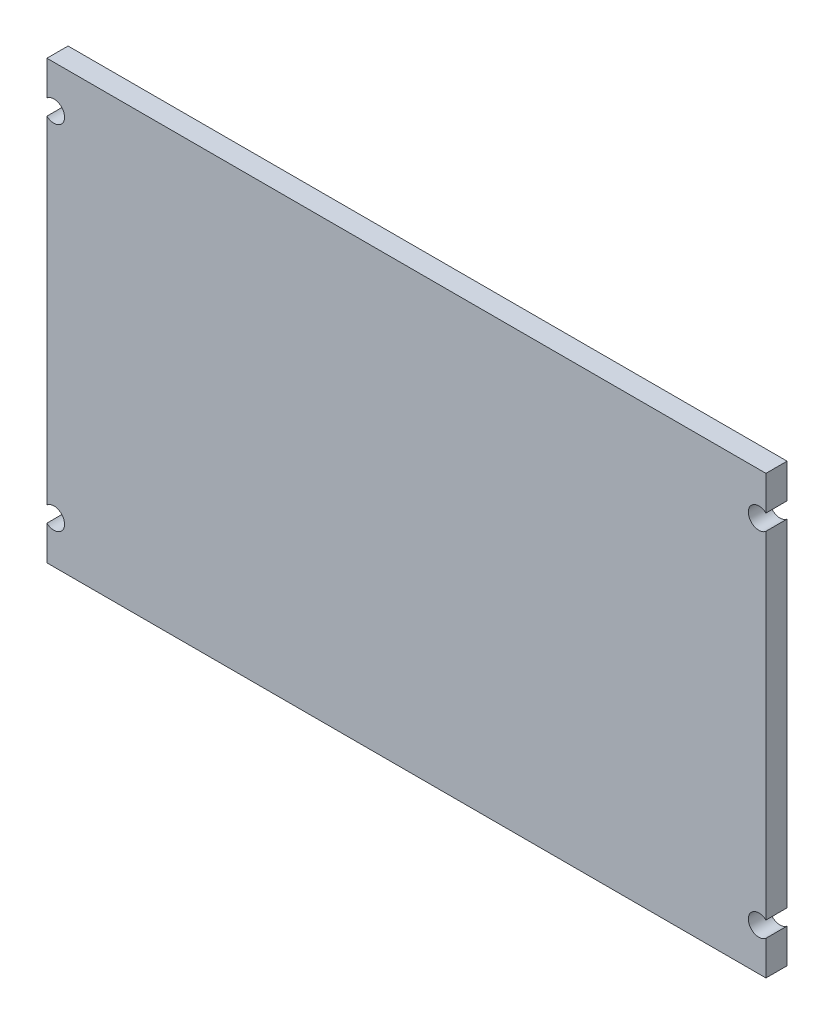
ISO-10303-21;
HEADER;
FILE_DESCRIPTION(('STEP AP214'),'2;1');
FILE_NAME('part.step','',(''),(''),'','','');
FILE_SCHEMA(('AUTOMOTIVE_DESIGN { 1 0 10303 214 1 1 1 1 }'));
ENDSEC;
DATA;
#1=APPLICATION_CONTEXT('core data for automotive mechanical design processes');
#2=APPLICATION_PROTOCOL_DEFINITION('international standard','automotive_design',2000,#1);
#3=PRODUCT_CONTEXT('',#1,'mechanical');
#4=PRODUCT('Part','Part','',(#3));
#5=PRODUCT_RELATED_PRODUCT_CATEGORY('part','',(#4));
#6=PRODUCT_DEFINITION_FORMATION('','',#4);
#7=PRODUCT_DEFINITION_CONTEXT('part definition',#1,'design');
#8=PRODUCT_DEFINITION('design','',#6,#7);
#9=PRODUCT_DEFINITION_SHAPE('','',#8);
#10=(LENGTH_UNIT() NAMED_UNIT(*) SI_UNIT(.MILLI.,.METRE.));
#11=(NAMED_UNIT(*) PLANE_ANGLE_UNIT() SI_UNIT($,.RADIAN.));
#12=(NAMED_UNIT(*) SI_UNIT($,.STERADIAN.) SOLID_ANGLE_UNIT());
#13=UNCERTAINTY_MEASURE_WITH_UNIT(LENGTH_MEASURE(1.E-05),#10,'distance_accuracy_value','');
#14=(GEOMETRIC_REPRESENTATION_CONTEXT(3) GLOBAL_UNCERTAINTY_ASSIGNED_CONTEXT((#13)) GLOBAL_UNIT_ASSIGNED_CONTEXT((#10,
#11,#12)) REPRESENTATION_CONTEXT('',''));
#15=CARTESIAN_POINT('',(0.,0.,0.));
#16=DIRECTION('',(0.,0.,1.));
#17=DIRECTION('',(1.,0.,0.));
#18=AXIS2_PLACEMENT_3D('',#15,#16,#17);
#19=CARTESIAN_POINT('',(51.,-31.,3.));
#20=DIRECTION('',(-1.,0.,0.));
#21=DIRECTION('',(0.,0.,1.));
#22=AXIS2_PLACEMENT_3D('',#19,#20,#21);
#23=PLANE('',#22);
#24=DIRECTION('',(0.,1.,0.));
#25=VECTOR('',#24,1.);
#26=CARTESIAN_POINT('',(51.,-31.,0.));
#27=LINE('',#26,#25);
#28=CARTESIAN_POINT('',(51.,-31.,0.));
#29=VERTEX_POINT('',#28);
#30=CARTESIAN_POINT('',(51.,-26.1180339887499,0.));
#31=VERTEX_POINT('',#30);
#32=EDGE_CURVE('E177',#29,#31,#27,.T.);
#33=ORIENTED_EDGE('',*,*,#32,.T.);
#34=DIRECTION('',(0.,0.,1.));
#35=VECTOR('',#34,1.);
#36=CARTESIAN_POINT('',(51.,-26.1180339887499,0.));
#37=LINE('',#36,#35);
#38=CARTESIAN_POINT('',(51.,-26.1180339887499,3.));
#39=VERTEX_POINT('',#38);
#40=EDGE_CURVE('E198',#31,#39,#37,.T.);
#41=ORIENTED_EDGE('',*,*,#40,.T.);
#42=DIRECTION('',(0.,1.,0.));
#43=VECTOR('',#42,1.);
#44=CARTESIAN_POINT('',(51.,-31.,3.));
#45=LINE('',#44,#43);
#46=CARTESIAN_POINT('',(51.,-31.,3.));
#47=VERTEX_POINT('',#46);
#48=EDGE_CURVE('E190',#47,#39,#45,.T.);
#49=ORIENTED_EDGE('',*,*,#48,.F.);
#50=DIRECTION('',(0.,0.,-1.));
#51=VECTOR('',#50,1.);
#52=CARTESIAN_POINT('',(51.,-31.,3.));
#53=LINE('',#52,#51);
#54=EDGE_CURVE('E151',#47,#29,#53,.T.);
#55=ORIENTED_EDGE('',*,*,#54,.T.);
#56=EDGE_LOOP('',(#33,#41,#49,#55));
#57=FACE_BOUND('',#56,.T.);
#58=ADVANCED_FACE('F36',(#57),#23,.F.);
#59=CARTESIAN_POINT('',(51.,-23.8819660112501,3.));
#60=VERTEX_POINT('',#59);
#61=CARTESIAN_POINT('',(51.,23.8819660112501,3.));
#62=VERTEX_POINT('',#61);
#63=EDGE_CURVE('E193',#60,#62,#45,.T.);
#64=ORIENTED_EDGE('',*,*,#63,.F.);
#65=DIRECTION('',(0.,0.,1.));
#66=VECTOR('',#65,1.);
#67=CARTESIAN_POINT('',(51.,-23.8819660112501,0.));
#68=LINE('',#67,#66);
#69=CARTESIAN_POINT('',(51.,-23.8819660112501,0.));
#70=VERTEX_POINT('',#69);
#71=EDGE_CURVE('E200',#60,#70,#68,.F.);
#72=ORIENTED_EDGE('',*,*,#71,.T.);
#73=CARTESIAN_POINT('',(51.,23.8819660112501,0.));
#74=VERTEX_POINT('',#73);
#75=EDGE_CURVE('E176',#70,#74,#27,.T.);
#76=ORIENTED_EDGE('',*,*,#75,.T.);
#77=DIRECTION('',(0.,0.,1.));
#78=VECTOR('',#77,1.);
#79=CARTESIAN_POINT('',(51.,23.8819660112501,0.));
#80=LINE('',#79,#78);
#81=EDGE_CURVE('E203',#74,#62,#80,.T.);
#82=ORIENTED_EDGE('',*,*,#81,.T.);
#83=EDGE_LOOP('',(#64,#72,#76,#82));
#84=FACE_BOUND('',#83,.T.);
#85=ADVANCED_FACE('F223',(#84),#23,.F.);
#86=CARTESIAN_POINT('',(-51.,-31.,3.));
#87=DIRECTION('',(1.,0.,0.));
#88=DIRECTION('',(0.,0.,-1.));
#89=AXIS2_PLACEMENT_3D('',#86,#87,#88);
#90=PLANE('',#89);
#91=DIRECTION('',(0.,-1.,0.));
#92=VECTOR('',#91,1.);
#93=CARTESIAN_POINT('',(-51.,-31.,0.));
#94=LINE('',#93,#92);
#95=CARTESIAN_POINT('',(-51.,23.8819660112501,0.));
#96=VERTEX_POINT('',#95);
#97=CARTESIAN_POINT('',(-51.,-23.8819660112501,0.));
#98=VERTEX_POINT('',#97);
#99=EDGE_CURVE('E134',#96,#98,#94,.T.);
#100=ORIENTED_EDGE('',*,*,#99,.T.);
#101=DIRECTION('',(0.,0.,1.));
#102=VECTOR('',#101,1.);
#103=CARTESIAN_POINT('',(-51.,-23.8819660112501,0.));
#104=LINE('',#103,#102);
#105=CARTESIAN_POINT('',(-51.,-23.8819660112501,3.));
#106=VERTEX_POINT('',#105);
#107=EDGE_CURVE('E50',#98,#106,#104,.T.);
#108=ORIENTED_EDGE('',*,*,#107,.T.);
#109=DIRECTION('',(0.,-1.,0.));
#110=VECTOR('',#109,1.);
#111=CARTESIAN_POINT('',(-51.,-31.,3.));
#112=LINE('',#111,#110);
#113=CARTESIAN_POINT('',(-51.,23.8819660112501,3.));
#114=VERTEX_POINT('',#113);
#115=EDGE_CURVE('E136',#114,#106,#112,.T.);
#116=ORIENTED_EDGE('',*,*,#115,.F.);
#117=DIRECTION('',(0.,0.,1.));
#118=VECTOR('',#117,1.);
#119=CARTESIAN_POINT('',(-51.,23.8819660112501,0.));
#120=LINE('',#119,#118);
#121=EDGE_CURVE('E123',#114,#96,#120,.F.);
#122=ORIENTED_EDGE('',*,*,#121,.T.);
#123=EDGE_LOOP('',(#100,#108,#116,#122));
#124=FACE_BOUND('',#123,.T.);
#125=ADVANCED_FACE('F133',(#124),#90,.F.);
#126=CARTESIAN_POINT('',(-51.,31.,0.));
#127=VERTEX_POINT('',#126);
#128=CARTESIAN_POINT('',(-51.,26.1180339887499,0.));
#129=VERTEX_POINT('',#128);
#130=EDGE_CURVE('E141',#127,#129,#94,.T.);
#131=ORIENTED_EDGE('',*,*,#130,.T.);
#132=DIRECTION('',(0.,0.,1.));
#133=VECTOR('',#132,1.);
#134=CARTESIAN_POINT('',(-51.,26.1180339887499,0.));
#135=LINE('',#134,#133);
#136=CARTESIAN_POINT('',(-51.,26.1180339887499,3.));
#137=VERTEX_POINT('',#136);
#138=EDGE_CURVE('E58',#129,#137,#135,.T.);
#139=ORIENTED_EDGE('',*,*,#138,.T.);
#140=CARTESIAN_POINT('',(-51.,31.,3.));
#141=VERTEX_POINT('',#140);
#142=EDGE_CURVE('E185',#141,#137,#112,.T.);
#143=ORIENTED_EDGE('',*,*,#142,.F.);
#144=DIRECTION('',(0.,0.,-1.));
#145=VECTOR('',#144,1.);
#146=CARTESIAN_POINT('',(-51.,31.,3.));
#147=LINE('',#146,#145);
#148=EDGE_CURVE('E158',#141,#127,#147,.T.);
#149=ORIENTED_EDGE('',*,*,#148,.T.);
#150=EDGE_LOOP('',(#131,#139,#143,#149));
#151=FACE_BOUND('',#150,.T.);
#152=ADVANCED_FACE('F245',(#151),#90,.F.);
#153=CARTESIAN_POINT('',(51.,26.1180339887499,3.));
#154=VERTEX_POINT('',#153);
#155=CARTESIAN_POINT('',(51.,31.,3.));
#156=VERTEX_POINT('',#155);
#157=EDGE_CURVE('E150',#154,#156,#45,.T.);
#158=ORIENTED_EDGE('',*,*,#157,.F.);
#159=DIRECTION('',(0.,0.,1.));
#160=VECTOR('',#159,1.);
#161=CARTESIAN_POINT('',(51.,26.1180339887499,0.));
#162=LINE('',#161,#160);
#163=CARTESIAN_POINT('',(51.,26.1180339887499,0.));
#164=VERTEX_POINT('',#163);
#165=EDGE_CURVE('E174',#154,#164,#162,.F.);
#166=ORIENTED_EDGE('',*,*,#165,.T.);
#167=CARTESIAN_POINT('',(51.,31.,0.));
#168=VERTEX_POINT('',#167);
#169=EDGE_CURVE('E173',#164,#168,#27,.T.);
#170=ORIENTED_EDGE('',*,*,#169,.T.);
#171=DIRECTION('',(0.,0.,-1.));
#172=VECTOR('',#171,1.);
#173=CARTESIAN_POINT('',(51.,31.,3.));
#174=LINE('',#173,#172);
#175=EDGE_CURVE('E129',#156,#168,#174,.T.);
#176=ORIENTED_EDGE('',*,*,#175,.F.);
#177=EDGE_LOOP('',(#158,#166,#170,#176));
#178=FACE_BOUND('',#177,.T.);
#179=ADVANCED_FACE('F38',(#178),#23,.F.);
#180=CARTESIAN_POINT('',(-51.,31.,3.));
#181=DIRECTION('',(0.,-1.,0.));
#182=DIRECTION('',(0.,0.,-1.));
#183=AXIS2_PLACEMENT_3D('',#180,#181,#182);
#184=PLANE('',#183);
#185=DIRECTION('',(-1.,0.,0.));
#186=VECTOR('',#185,1.);
#187=CARTESIAN_POINT('',(-51.,31.,0.));
#188=LINE('',#187,#186);
#189=EDGE_CURVE('E145',#168,#127,#188,.T.);
#190=ORIENTED_EDGE('',*,*,#189,.T.);
#191=ORIENTED_EDGE('',*,*,#148,.F.);
#192=DIRECTION('',(-1.,0.,0.));
#193=VECTOR('',#192,1.);
#194=CARTESIAN_POINT('',(-51.,31.,3.));
#195=LINE('',#194,#193);
#196=EDGE_CURVE('E168',#156,#141,#195,.T.);
#197=ORIENTED_EDGE('',*,*,#196,.F.);
#198=ORIENTED_EDGE('',*,*,#175,.T.);
#199=EDGE_LOOP('',(#190,#191,#197,#198));
#200=FACE_BOUND('',#199,.T.);
#201=ADVANCED_FACE('F165',(#200),#184,.F.);
#202=CARTESIAN_POINT('',(-51.,-26.1180339887499,3.));
#203=VERTEX_POINT('',#202);
#204=CARTESIAN_POINT('',(-51.,-31.,3.));
#205=VERTEX_POINT('',#204);
#206=EDGE_CURVE('E188',#203,#205,#112,.T.);
#207=ORIENTED_EDGE('',*,*,#206,.F.);
#208=DIRECTION('',(0.,0.,1.));
#209=VECTOR('',#208,1.);
#210=CARTESIAN_POINT('',(-51.,-26.1180339887499,0.));
#211=LINE('',#210,#209);
#212=CARTESIAN_POINT('',(-51.,-26.1180339887499,0.));
#213=VERTEX_POINT('',#212);
#214=EDGE_CURVE('E195',#203,#213,#211,.F.);
#215=ORIENTED_EDGE('',*,*,#214,.T.);
#216=CARTESIAN_POINT('',(-51.,-31.,0.));
#217=VERTEX_POINT('',#216);
#218=EDGE_CURVE('E142',#213,#217,#94,.T.);
#219=ORIENTED_EDGE('',*,*,#218,.T.);
#220=DIRECTION('',(0.,0.,-1.));
#221=VECTOR('',#220,1.);
#222=CARTESIAN_POINT('',(-51.,-31.,3.));
#223=LINE('',#222,#221);
#224=EDGE_CURVE('E154',#205,#217,#223,.T.);
#225=ORIENTED_EDGE('',*,*,#224,.F.);
#226=EDGE_LOOP('',(#207,#215,#219,#225));
#227=FACE_BOUND('',#226,.T.);
#228=ADVANCED_FACE('F240',(#227),#90,.F.);
#229=CARTESIAN_POINT('',(-51.,-31.,3.));
#230=DIRECTION('',(0.,1.,0.));
#231=DIRECTION('',(0.,0.,1.));
#232=AXIS2_PLACEMENT_3D('',#229,#230,#231);
#233=PLANE('',#232);
#234=DIRECTION('',(1.,0.,0.));
#235=VECTOR('',#234,1.);
#236=CARTESIAN_POINT('',(-51.,-31.,0.));
#237=LINE('',#236,#235);
#238=EDGE_CURVE('E144',#217,#29,#237,.T.);
#239=ORIENTED_EDGE('',*,*,#238,.T.);
#240=ORIENTED_EDGE('',*,*,#54,.F.);
#241=DIRECTION('',(1.,0.,0.));
#242=VECTOR('',#241,1.);
#243=CARTESIAN_POINT('',(-51.,-31.,3.));
#244=LINE('',#243,#242);
#245=EDGE_CURVE('E155',#205,#47,#244,.T.);
#246=ORIENTED_EDGE('',*,*,#245,.F.);
#247=ORIENTED_EDGE('',*,*,#224,.T.);
#248=EDGE_LOOP('',(#239,#240,#246,#247));
#249=FACE_BOUND('',#248,.T.);
#250=ADVANCED_FACE('F236',(#249),#233,.F.);
#251=CARTESIAN_POINT('',(0.,0.,3.));
#252=DIRECTION('',(0.,0.,-1.));
#253=DIRECTION('',(-1.,0.,0.));
#254=AXIS2_PLACEMENT_3D('',#251,#252,#253);
#255=PLANE('',#254);
#256=ORIENTED_EDGE('',*,*,#115,.T.);
#257=CARTESIAN_POINT('',(-50.,-25.,3.));
#258=DIRECTION('',(0.,0.,1.));
#259=DIRECTION('',(1.,0.,0.));
#260=AXIS2_PLACEMENT_3D('',#257,#258,#259);
#261=CIRCLE('',#260,1.5);
#262=EDGE_CURVE('E210',#203,#106,#261,.T.);
#263=ORIENTED_EDGE('',*,*,#262,.F.);
#264=ORIENTED_EDGE('',*,*,#206,.T.);
#265=ORIENTED_EDGE('',*,*,#245,.T.);
#266=ORIENTED_EDGE('',*,*,#48,.T.);
#267=CARTESIAN_POINT('',(50.,-25.,3.));
#268=DIRECTION('',(0.,0.,1.));
#269=DIRECTION('',(1.,0.,0.));
#270=AXIS2_PLACEMENT_3D('',#267,#268,#269);
#271=CIRCLE('',#270,1.5);
#272=EDGE_CURVE('E212',#60,#39,#271,.T.);
#273=ORIENTED_EDGE('',*,*,#272,.F.);
#274=ORIENTED_EDGE('',*,*,#63,.T.);
#275=CARTESIAN_POINT('',(50.,25.,3.));
#276=DIRECTION('',(0.,0.,1.));
#277=DIRECTION('',(1.,0.,0.));
#278=AXIS2_PLACEMENT_3D('',#275,#276,#277);
#279=CIRCLE('',#278,1.5);
#280=EDGE_CURVE('E217',#154,#62,#279,.T.);
#281=ORIENTED_EDGE('',*,*,#280,.F.);
#282=ORIENTED_EDGE('',*,*,#157,.T.);
#283=ORIENTED_EDGE('',*,*,#196,.T.);
#284=ORIENTED_EDGE('',*,*,#142,.T.);
#285=CARTESIAN_POINT('',(-50.,25.,3.));
#286=DIRECTION('',(0.,0.,1.));
#287=DIRECTION('',(1.,0.,0.));
#288=AXIS2_PLACEMENT_3D('',#285,#286,#287);
#289=CIRCLE('',#288,1.5);
#290=EDGE_CURVE('E137',#114,#137,#289,.T.);
#291=ORIENTED_EDGE('',*,*,#290,.F.);
#292=EDGE_LOOP('',(#256,#263,#264,#265,#266,#273,#274,#281,#282,#283,#284,#291));
#293=FACE_BOUND('',#292,.T.);
#294=ADVANCED_FACE('F229',(#293),#255,.F.);
#295=CARTESIAN_POINT('',(0.,0.,0.));
#296=DIRECTION('',(0.,0.,-1.));
#297=DIRECTION('',(-1.,0.,0.));
#298=AXIS2_PLACEMENT_3D('',#295,#296,#297);
#299=PLANE('',#298);
#300=CARTESIAN_POINT('',(-50.,-25.,0.));
#301=DIRECTION('',(0.,0.,-1.));
#302=DIRECTION('',(-1.,0.,0.));
#303=AXIS2_PLACEMENT_3D('',#300,#301,#302);
#304=CIRCLE('',#303,1.5);
#305=EDGE_CURVE('E11',#98,#213,#304,.T.);
#306=ORIENTED_EDGE('',*,*,#305,.F.);
#307=ORIENTED_EDGE('',*,*,#99,.F.);
#308=CARTESIAN_POINT('',(-50.,25.,0.));
#309=DIRECTION('',(0.,0.,-1.));
#310=DIRECTION('',(-1.,0.,0.));
#311=AXIS2_PLACEMENT_3D('',#308,#309,#310);
#312=CIRCLE('',#311,1.5);
#313=EDGE_CURVE('E44',#129,#96,#312,.T.);
#314=ORIENTED_EDGE('',*,*,#313,.F.);
#315=ORIENTED_EDGE('',*,*,#130,.F.);
#316=ORIENTED_EDGE('',*,*,#189,.F.);
#317=ORIENTED_EDGE('',*,*,#169,.F.);
#318=CARTESIAN_POINT('',(50.,25.,0.));
#319=DIRECTION('',(0.,0.,1.));
#320=DIRECTION('',(1.,0.,0.));
#321=AXIS2_PLACEMENT_3D('',#318,#319,#320);
#322=CIRCLE('',#321,1.5);
#323=EDGE_CURVE('E209',#164,#74,#322,.T.);
#324=ORIENTED_EDGE('',*,*,#323,.T.);
#325=ORIENTED_EDGE('',*,*,#75,.F.);
#326=CARTESIAN_POINT('',(50.,-25.,0.));
#327=DIRECTION('',(0.,0.,1.));
#328=DIRECTION('',(1.,0.,0.));
#329=AXIS2_PLACEMENT_3D('',#326,#327,#328);
#330=CIRCLE('',#329,1.5);
#331=EDGE_CURVE('E214',#70,#31,#330,.T.);
#332=ORIENTED_EDGE('',*,*,#331,.T.);
#333=ORIENTED_EDGE('',*,*,#32,.F.);
#334=ORIENTED_EDGE('',*,*,#238,.F.);
#335=ORIENTED_EDGE('',*,*,#218,.F.);
#336=EDGE_LOOP('',(#306,#307,#314,#315,#316,#317,#324,#325,#332,#333,#334,#335));
#337=FACE_BOUND('',#336,.T.);
#338=ADVANCED_FACE('F139',(#337),#299,.T.);
#339=CARTESIAN_POINT('',(-50.,25.,0.));
#340=DIRECTION('',(0.,0.,1.));
#341=DIRECTION('',(1.,0.,0.));
#342=AXIS2_PLACEMENT_3D('',#339,#340,#341);
#343=CYLINDRICAL_SURFACE('',#342,1.5);
#344=ORIENTED_EDGE('',*,*,#313,.T.);
#345=ORIENTED_EDGE('',*,*,#121,.F.);
#346=ORIENTED_EDGE('',*,*,#290,.T.);
#347=ORIENTED_EDGE('',*,*,#138,.F.);
#348=EDGE_LOOP('',(#344,#345,#346,#347));
#349=FACE_BOUND('',#348,.T.);
#350=ADVANCED_FACE('F122',(#349),#343,.F.);
#351=CARTESIAN_POINT('',(50.,25.,0.));
#352=DIRECTION('',(0.,0.,1.));
#353=DIRECTION('',(1.,0.,0.));
#354=AXIS2_PLACEMENT_3D('',#351,#352,#353);
#355=CYLINDRICAL_SURFACE('',#354,1.5);
#356=ORIENTED_EDGE('',*,*,#323,.F.);
#357=ORIENTED_EDGE('',*,*,#165,.F.);
#358=ORIENTED_EDGE('',*,*,#280,.T.);
#359=ORIENTED_EDGE('',*,*,#81,.F.);
#360=EDGE_LOOP('',(#356,#357,#358,#359));
#361=FACE_BOUND('',#360,.T.);
#362=ADVANCED_FACE('F309',(#361),#355,.F.);
#363=CARTESIAN_POINT('',(50.,-25.,0.));
#364=DIRECTION('',(0.,0.,1.));
#365=DIRECTION('',(1.,0.,0.));
#366=AXIS2_PLACEMENT_3D('',#363,#364,#365);
#367=CYLINDRICAL_SURFACE('',#366,1.5);
#368=ORIENTED_EDGE('',*,*,#331,.F.);
#369=ORIENTED_EDGE('',*,*,#71,.F.);
#370=ORIENTED_EDGE('',*,*,#272,.T.);
#371=ORIENTED_EDGE('',*,*,#40,.F.);
#372=EDGE_LOOP('',(#368,#369,#370,#371));
#373=FACE_BOUND('',#372,.T.);
#374=ADVANCED_FACE('F227',(#373),#367,.F.);
#375=CARTESIAN_POINT('',(-50.,-25.,0.));
#376=DIRECTION('',(0.,0.,1.));
#377=DIRECTION('',(1.,0.,0.));
#378=AXIS2_PLACEMENT_3D('',#375,#376,#377);
#379=CYLINDRICAL_SURFACE('',#378,1.5);
#380=ORIENTED_EDGE('',*,*,#305,.T.);
#381=ORIENTED_EDGE('',*,*,#214,.F.);
#382=ORIENTED_EDGE('',*,*,#262,.T.);
#383=ORIENTED_EDGE('',*,*,#107,.F.);
#384=EDGE_LOOP('',(#380,#381,#382,#383));
#385=FACE_BOUND('',#384,.T.);
#386=ADVANCED_FACE('F242',(#385),#379,.F.);
#387=CLOSED_SHELL('',(#58,#85,#125,#152,#179,#201,#228,#250,#294,#338,#350,#362,#374,#386));
#388=MANIFOLD_SOLID_BREP('B2',#387);
#389=ADVANCED_BREP_SHAPE_REPRESENTATION('',(#18,#388),#14);
#390=SHAPE_DEFINITION_REPRESENTATION(#9,#389);
ENDSEC;
END-ISO-10303-21;
